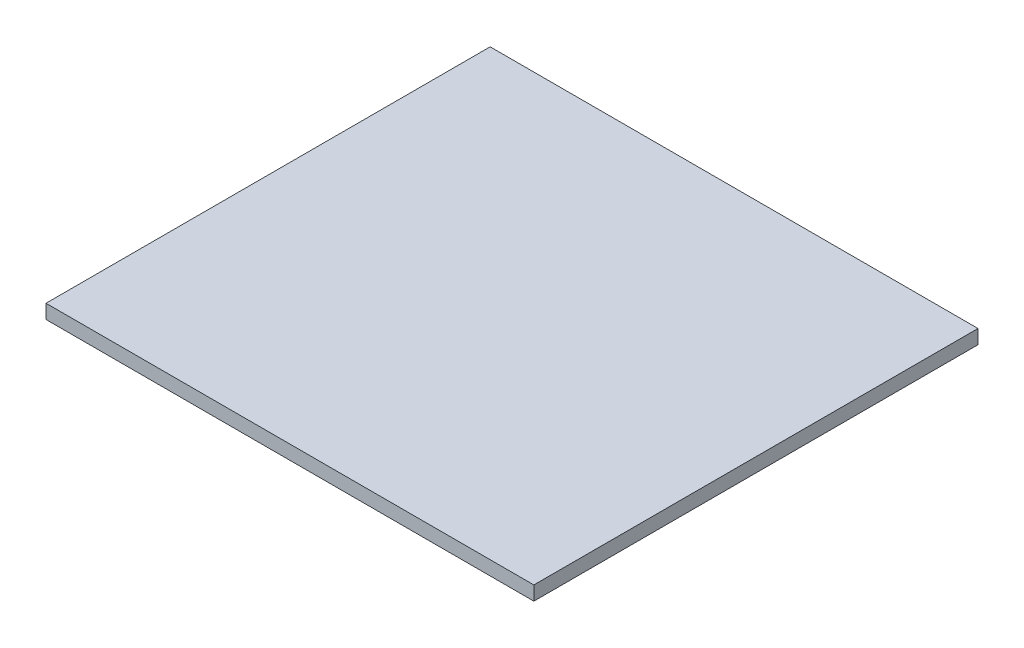
ISO-10303-21;
HEADER;
FILE_DESCRIPTION(('STEP AP214'),'2;1');
FILE_NAME('part.step','',(''),(''),'','','');
FILE_SCHEMA(('AUTOMOTIVE_DESIGN { 1 0 10303 214 1 1 1 1 }'));
ENDSEC;
DATA;
#1=APPLICATION_CONTEXT('core data for automotive mechanical design processes');
#2=APPLICATION_PROTOCOL_DEFINITION('international standard','automotive_design',2000,#1);
#3=PRODUCT_CONTEXT('',#1,'mechanical');
#4=PRODUCT('Part','Part','',(#3));
#5=PRODUCT_RELATED_PRODUCT_CATEGORY('part','',(#4));
#6=PRODUCT_DEFINITION_FORMATION('','',#4);
#7=PRODUCT_DEFINITION_CONTEXT('part definition',#1,'design');
#8=PRODUCT_DEFINITION('design','',#6,#7);
#9=PRODUCT_DEFINITION_SHAPE('','',#8);
#10=(LENGTH_UNIT() NAMED_UNIT(*) SI_UNIT(.MILLI.,.METRE.));
#11=(NAMED_UNIT(*) PLANE_ANGLE_UNIT() SI_UNIT($,.RADIAN.));
#12=(NAMED_UNIT(*) SI_UNIT($,.STERADIAN.) SOLID_ANGLE_UNIT());
#13=UNCERTAINTY_MEASURE_WITH_UNIT(LENGTH_MEASURE(1.E-05),#10,'distance_accuracy_value','');
#14=(GEOMETRIC_REPRESENTATION_CONTEXT(3) GLOBAL_UNCERTAINTY_ASSIGNED_CONTEXT((#13)) GLOBAL_UNIT_ASSIGNED_CONTEXT((#10,
#11,#12)) REPRESENTATION_CONTEXT('',''));
#15=CARTESIAN_POINT('',(0.,0.,0.));
#16=DIRECTION('',(0.,0.,1.));
#17=DIRECTION('',(1.,0.,0.));
#18=AXIS2_PLACEMENT_3D('',#15,#16,#17);
#19=CARTESIAN_POINT('',(0.,10.,0.));
#20=DIRECTION('',(1.,0.,0.));
#21=DIRECTION('',(0.,0.,-1.));
#22=AXIS2_PLACEMENT_3D('',#19,#20,#21);
#23=PLANE('',#22);
#24=DIRECTION('',(0.,0.,1.));
#25=VECTOR('',#24,1.);
#26=CARTESIAN_POINT('',(0.,0.,0.));
#27=LINE('',#26,#25);
#28=CARTESIAN_POINT('',(0.,0.,-315.));
#29=VERTEX_POINT('',#28);
#30=CARTESIAN_POINT('',(0.,0.,0.));
#31=VERTEX_POINT('',#30);
#32=EDGE_CURVE('E98',#29,#31,#27,.T.);
#33=ORIENTED_EDGE('',*,*,#32,.T.);
#34=DIRECTION('',(0.,-1.,0.));
#35=VECTOR('',#34,1.);
#36=CARTESIAN_POINT('',(0.,10.,0.));
#37=LINE('',#36,#35);
#38=CARTESIAN_POINT('',(0.,10.,0.));
#39=VERTEX_POINT('',#38);
#40=EDGE_CURVE('E11',#39,#31,#37,.T.);
#41=ORIENTED_EDGE('',*,*,#40,.F.);
#42=DIRECTION('',(0.,0.,1.));
#43=VECTOR('',#42,1.);
#44=CARTESIAN_POINT('',(0.,10.,0.));
#45=LINE('',#44,#43);
#46=CARTESIAN_POINT('',(0.,10.,-315.));
#47=VERTEX_POINT('',#46);
#48=EDGE_CURVE('E86',#47,#39,#45,.T.);
#49=ORIENTED_EDGE('',*,*,#48,.F.);
#50=DIRECTION('',(0.,-1.,0.));
#51=VECTOR('',#50,1.);
#52=CARTESIAN_POINT('',(0.,10.,-315.));
#53=LINE('',#52,#51);
#54=EDGE_CURVE('E94',#47,#29,#53,.T.);
#55=ORIENTED_EDGE('',*,*,#54,.T.);
#56=EDGE_LOOP('',(#33,#41,#49,#55));
#57=FACE_BOUND('',#56,.T.);
#58=ADVANCED_FACE('F35',(#57),#23,.F.);
#59=CARTESIAN_POINT('',(0.,10.,0.));
#60=DIRECTION('',(0.,0.,-1.));
#61=DIRECTION('',(-1.,0.,0.));
#62=AXIS2_PLACEMENT_3D('',#59,#60,#61);
#63=PLANE('',#62);
#64=DIRECTION('',(1.,0.,0.));
#65=VECTOR('',#64,1.);
#66=CARTESIAN_POINT('',(0.,0.,0.));
#67=LINE('',#66,#65);
#68=CARTESIAN_POINT('',(346.,0.,0.));
#69=VERTEX_POINT('',#68);
#70=EDGE_CURVE('E90',#31,#69,#67,.T.);
#71=ORIENTED_EDGE('',*,*,#70,.T.);
#72=DIRECTION('',(0.,-1.,0.));
#73=VECTOR('',#72,1.);
#74=CARTESIAN_POINT('',(346.,10.,0.));
#75=LINE('',#74,#73);
#76=CARTESIAN_POINT('',(346.,10.,0.));
#77=VERTEX_POINT('',#76);
#78=EDGE_CURVE('E43',#77,#69,#75,.T.);
#79=ORIENTED_EDGE('',*,*,#78,.F.);
#80=DIRECTION('',(1.,0.,0.));
#81=VECTOR('',#80,1.);
#82=CARTESIAN_POINT('',(0.,10.,0.));
#83=LINE('',#82,#81);
#84=EDGE_CURVE('E81',#39,#77,#83,.T.);
#85=ORIENTED_EDGE('',*,*,#84,.F.);
#86=ORIENTED_EDGE('',*,*,#40,.T.);
#87=EDGE_LOOP('',(#71,#79,#85,#86));
#88=FACE_BOUND('',#87,.T.);
#89=ADVANCED_FACE('F89',(#88),#63,.F.);
#90=CARTESIAN_POINT('',(346.,10.,0.));
#91=DIRECTION('',(-1.,0.,0.));
#92=DIRECTION('',(0.,0.,1.));
#93=AXIS2_PLACEMENT_3D('',#90,#91,#92);
#94=PLANE('',#93);
#95=DIRECTION('',(0.,0.,-1.));
#96=VECTOR('',#95,1.);
#97=CARTESIAN_POINT('',(346.,0.,0.));
#98=LINE('',#97,#96);
#99=CARTESIAN_POINT('',(346.,0.,-315.));
#100=VERTEX_POINT('',#99);
#101=EDGE_CURVE('E68',#69,#100,#98,.T.);
#102=ORIENTED_EDGE('',*,*,#101,.T.);
#103=DIRECTION('',(0.,-1.,0.));
#104=VECTOR('',#103,1.);
#105=CARTESIAN_POINT('',(346.,10.,-315.));
#106=LINE('',#105,#104);
#107=CARTESIAN_POINT('',(346.,10.,-315.));
#108=VERTEX_POINT('',#107);
#109=EDGE_CURVE('E91',#108,#100,#106,.T.);
#110=ORIENTED_EDGE('',*,*,#109,.F.);
#111=DIRECTION('',(0.,0.,-1.));
#112=VECTOR('',#111,1.);
#113=CARTESIAN_POINT('',(346.,10.,0.));
#114=LINE('',#113,#112);
#115=EDGE_CURVE('E84',#77,#108,#114,.T.);
#116=ORIENTED_EDGE('',*,*,#115,.F.);
#117=ORIENTED_EDGE('',*,*,#78,.T.);
#118=EDGE_LOOP('',(#102,#110,#116,#117));
#119=FACE_BOUND('',#118,.T.);
#120=ADVANCED_FACE('F92',(#119),#94,.F.);
#121=CARTESIAN_POINT('',(0.,10.,-315.));
#122=DIRECTION('',(0.,0.,1.));
#123=DIRECTION('',(1.,0.,0.));
#124=AXIS2_PLACEMENT_3D('',#121,#122,#123);
#125=PLANE('',#124);
#126=DIRECTION('',(-1.,0.,0.));
#127=VECTOR('',#126,1.);
#128=CARTESIAN_POINT('',(0.,0.,-315.));
#129=LINE('',#128,#127);
#130=EDGE_CURVE('E74',#100,#29,#129,.T.);
#131=ORIENTED_EDGE('',*,*,#130,.T.);
#132=ORIENTED_EDGE('',*,*,#54,.F.);
#133=DIRECTION('',(-1.,0.,0.));
#134=VECTOR('',#133,1.);
#135=CARTESIAN_POINT('',(0.,10.,-315.));
#136=LINE('',#135,#134);
#137=EDGE_CURVE('E51',#108,#47,#136,.T.);
#138=ORIENTED_EDGE('',*,*,#137,.F.);
#139=ORIENTED_EDGE('',*,*,#109,.T.);
#140=EDGE_LOOP('',(#131,#132,#138,#139));
#141=FACE_BOUND('',#140,.T.);
#142=ADVANCED_FACE('F105',(#141),#125,.F.);
#143=CARTESIAN_POINT('',(0.,10.,0.));
#144=DIRECTION('',(0.,-1.,0.));
#145=DIRECTION('',(0.,0.,-1.));
#146=AXIS2_PLACEMENT_3D('',#143,#144,#145);
#147=PLANE('',#146);
#148=ORIENTED_EDGE('',*,*,#48,.T.);
#149=ORIENTED_EDGE('',*,*,#84,.T.);
#150=ORIENTED_EDGE('',*,*,#115,.T.);
#151=ORIENTED_EDGE('',*,*,#137,.T.);
#152=EDGE_LOOP('',(#148,#149,#150,#151));
#153=FACE_BOUND('',#152,.T.);
#154=ADVANCED_FACE('F82',(#153),#147,.F.);
#155=CARTESIAN_POINT('',(0.,0.,0.));
#156=DIRECTION('',(0.,-1.,0.));
#157=DIRECTION('',(0.,0.,-1.));
#158=AXIS2_PLACEMENT_3D('',#155,#156,#157);
#159=PLANE('',#158);
#160=ORIENTED_EDGE('',*,*,#32,.F.);
#161=ORIENTED_EDGE('',*,*,#130,.F.);
#162=ORIENTED_EDGE('',*,*,#101,.F.);
#163=ORIENTED_EDGE('',*,*,#70,.F.);
#164=EDGE_LOOP('',(#160,#161,#162,#163));
#165=FACE_BOUND('',#164,.T.);
#166=ADVANCED_FACE('F108',(#165),#159,.T.);
#167=CLOSED_SHELL('',(#58,#89,#120,#142,#154,#166));
#168=MANIFOLD_SOLID_BREP('B2',#167);
#169=ADVANCED_BREP_SHAPE_REPRESENTATION('',(#18,#168),#14);
#170=SHAPE_DEFINITION_REPRESENTATION(#9,#169);
ENDSEC;
END-ISO-10303-21;
